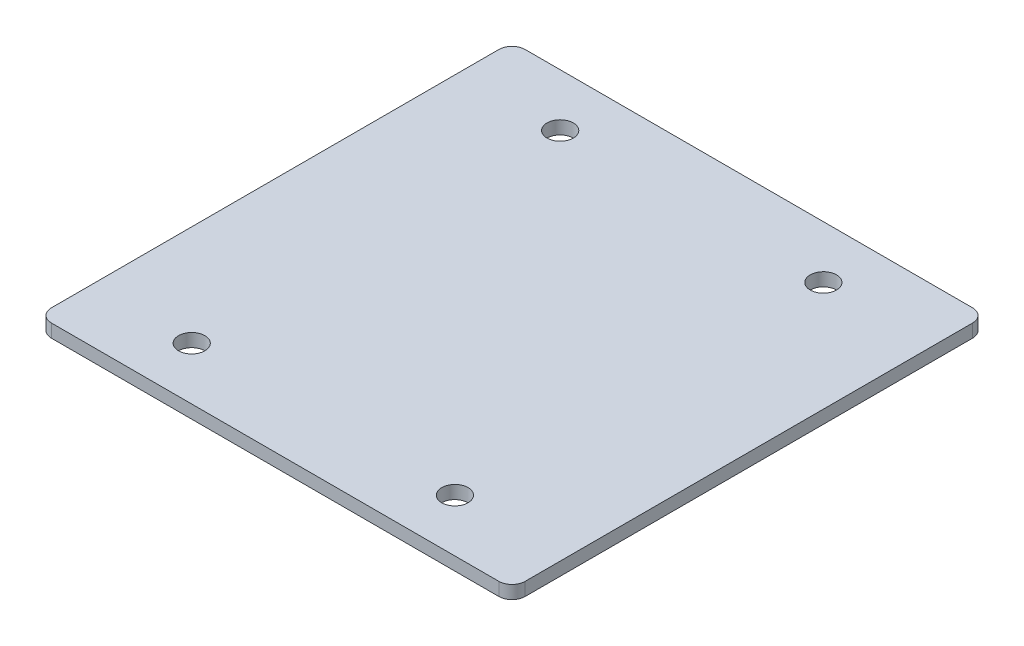
ISO-10303-21;
HEADER;
FILE_DESCRIPTION(('STEP AP214'),'2;1');
FILE_NAME('part.step','',(''),(''),'','','');
FILE_SCHEMA(('AUTOMOTIVE_DESIGN { 1 0 10303 214 1 1 1 1 }'));
ENDSEC;
DATA;
#1=APPLICATION_CONTEXT('core data for automotive mechanical design processes');
#2=APPLICATION_PROTOCOL_DEFINITION('international standard','automotive_design',2000,#1);
#3=PRODUCT_CONTEXT('',#1,'mechanical');
#4=PRODUCT('Part','Part','',(#3));
#5=PRODUCT_RELATED_PRODUCT_CATEGORY('part','',(#4));
#6=PRODUCT_DEFINITION_FORMATION('','',#4);
#7=PRODUCT_DEFINITION_CONTEXT('part definition',#1,'design');
#8=PRODUCT_DEFINITION('design','',#6,#7);
#9=PRODUCT_DEFINITION_SHAPE('','',#8);
#10=(LENGTH_UNIT() NAMED_UNIT(*) SI_UNIT(.MILLI.,.METRE.));
#11=(NAMED_UNIT(*) PLANE_ANGLE_UNIT() SI_UNIT($,.RADIAN.));
#12=(NAMED_UNIT(*) SI_UNIT($,.STERADIAN.) SOLID_ANGLE_UNIT());
#13=UNCERTAINTY_MEASURE_WITH_UNIT(LENGTH_MEASURE(1.E-05),#10,'distance_accuracy_value','');
#14=(GEOMETRIC_REPRESENTATION_CONTEXT(3) GLOBAL_UNCERTAINTY_ASSIGNED_CONTEXT((#13)) GLOBAL_UNIT_ASSIGNED_CONTEXT((#10,
#11,#12)) REPRESENTATION_CONTEXT('',''));
#15=CARTESIAN_POINT('',(0.,0.,0.));
#16=DIRECTION('',(0.,0.,1.));
#17=DIRECTION('',(1.,0.,0.));
#18=AXIS2_PLACEMENT_3D('',#15,#16,#17);
#19=CARTESIAN_POINT('',(0.,3.175,0.));
#20=DIRECTION('',(1.,0.,0.));
#21=DIRECTION('',(0.,0.,-1.));
#22=AXIS2_PLACEMENT_3D('',#19,#20,#21);
#23=PLANE('',#22);
#24=DIRECTION('',(0.,0.,1.));
#25=VECTOR('',#24,1.);
#26=CARTESIAN_POINT('',(0.,3.175,0.));
#27=LINE('',#26,#25);
#28=CARTESIAN_POINT('',(0.,3.175,-111.125));
#29=VERTEX_POINT('',#28);
#30=CARTESIAN_POINT('',(0.,3.175,-3.175));
#31=VERTEX_POINT('',#30);
#32=EDGE_CURVE('E124',#29,#31,#27,.T.);
#33=ORIENTED_EDGE('',*,*,#32,.F.);
#34=DIRECTION('',(0.,-1.,0.));
#35=VECTOR('',#34,1.);
#36=CARTESIAN_POINT('',(0.,3.175,-111.125));
#37=LINE('',#36,#35);
#38=CARTESIAN_POINT('',(0.,0.,-111.125));
#39=VERTEX_POINT('',#38);
#40=EDGE_CURVE('E150',#29,#39,#37,.T.);
#41=ORIENTED_EDGE('',*,*,#40,.T.);
#42=DIRECTION('',(0.,0.,1.));
#43=VECTOR('',#42,1.);
#44=CARTESIAN_POINT('',(0.,0.,0.));
#45=LINE('',#44,#43);
#46=CARTESIAN_POINT('',(0.,0.,-3.175));
#47=VERTEX_POINT('',#46);
#48=EDGE_CURVE('E156',#39,#47,#45,.T.);
#49=ORIENTED_EDGE('',*,*,#48,.T.);
#50=DIRECTION('',(0.,-1.,0.));
#51=VECTOR('',#50,1.);
#52=CARTESIAN_POINT('',(0.,3.175,-3.175));
#53=LINE('',#52,#51);
#54=EDGE_CURVE('E148',#47,#31,#53,.F.);
#55=ORIENTED_EDGE('',*,*,#54,.T.);
#56=EDGE_LOOP('',(#33,#41,#49,#55));
#57=FACE_BOUND('',#56,.T.);
#58=ADVANCED_FACE('F32',(#57),#23,.F.);
#59=CARTESIAN_POINT('',(0.,3.175,0.));
#60=DIRECTION('',(0.,0.,-1.));
#61=DIRECTION('',(-1.,0.,0.));
#62=AXIS2_PLACEMENT_3D('',#59,#60,#61);
#63=PLANE('',#62);
#64=DIRECTION('',(1.,0.,0.));
#65=VECTOR('',#64,1.);
#66=CARTESIAN_POINT('',(0.,3.175,0.));
#67=LINE('',#66,#65);
#68=CARTESIAN_POINT('',(3.175,3.175,0.));
#69=VERTEX_POINT('',#68);
#70=CARTESIAN_POINT('',(111.125,3.175,0.));
#71=VERTEX_POINT('',#70);
#72=EDGE_CURVE('E127',#69,#71,#67,.T.);
#73=ORIENTED_EDGE('',*,*,#72,.F.);
#74=DIRECTION('',(0.,-1.,0.));
#75=VECTOR('',#74,1.);
#76=CARTESIAN_POINT('',(3.175,3.175,0.));
#77=LINE('',#76,#75);
#78=CARTESIAN_POINT('',(3.175,0.,0.));
#79=VERTEX_POINT('',#78);
#80=EDGE_CURVE('E11',#69,#79,#77,.T.);
#81=ORIENTED_EDGE('',*,*,#80,.T.);
#82=DIRECTION('',(1.,0.,0.));
#83=VECTOR('',#82,1.);
#84=CARTESIAN_POINT('',(0.,0.,0.));
#85=LINE('',#84,#83);
#86=CARTESIAN_POINT('',(111.125,0.,0.));
#87=VERTEX_POINT('',#86);
#88=EDGE_CURVE('E129',#79,#87,#85,.T.);
#89=ORIENTED_EDGE('',*,*,#88,.T.);
#90=DIRECTION('',(0.,-1.,0.));
#91=VECTOR('',#90,1.);
#92=CARTESIAN_POINT('',(111.125,3.175,0.));
#93=LINE('',#92,#91);
#94=EDGE_CURVE('E40',#87,#71,#93,.F.);
#95=ORIENTED_EDGE('',*,*,#94,.T.);
#96=EDGE_LOOP('',(#73,#81,#89,#95));
#97=FACE_BOUND('',#96,.T.);
#98=ADVANCED_FACE('F217',(#97),#63,.F.);
#99=CARTESIAN_POINT('',(114.3,3.175,0.));
#100=DIRECTION('',(-1.,0.,0.));
#101=DIRECTION('',(0.,0.,1.));
#102=AXIS2_PLACEMENT_3D('',#99,#100,#101);
#103=PLANE('',#102);
#104=DIRECTION('',(0.,0.,-1.));
#105=VECTOR('',#104,1.);
#106=CARTESIAN_POINT('',(114.3,0.,0.));
#107=LINE('',#106,#105);
#108=CARTESIAN_POINT('',(114.3,0.,-3.175));
#109=VERTEX_POINT('',#108);
#110=CARTESIAN_POINT('',(114.3,0.,-111.125));
#111=VERTEX_POINT('',#110);
#112=EDGE_CURVE('E125',#109,#111,#107,.T.);
#113=ORIENTED_EDGE('',*,*,#112,.T.);
#114=DIRECTION('',(0.,-1.,0.));
#115=VECTOR('',#114,1.);
#116=CARTESIAN_POINT('',(114.3,3.175,-111.125));
#117=LINE('',#116,#115);
#118=CARTESIAN_POINT('',(114.3,3.175,-111.125));
#119=VERTEX_POINT('',#118);
#120=EDGE_CURVE('E103',#111,#119,#117,.F.);
#121=ORIENTED_EDGE('',*,*,#120,.T.);
#122=DIRECTION('',(0.,0.,-1.));
#123=VECTOR('',#122,1.);
#124=CARTESIAN_POINT('',(114.3,3.175,0.));
#125=LINE('',#124,#123);
#126=CARTESIAN_POINT('',(114.3,3.175,-3.175));
#127=VERTEX_POINT('',#126);
#128=EDGE_CURVE('E168',#127,#119,#125,.T.);
#129=ORIENTED_EDGE('',*,*,#128,.F.);
#130=DIRECTION('',(0.,-1.,0.));
#131=VECTOR('',#130,1.);
#132=CARTESIAN_POINT('',(114.3,3.175,-3.175));
#133=LINE('',#132,#131);
#134=EDGE_CURVE('E108',#127,#109,#133,.T.);
#135=ORIENTED_EDGE('',*,*,#134,.T.);
#136=EDGE_LOOP('',(#113,#121,#129,#135));
#137=FACE_BOUND('',#136,.T.);
#138=ADVANCED_FACE('F215',(#137),#103,.F.);
#139=CARTESIAN_POINT('',(0.,3.175,-114.3));
#140=DIRECTION('',(0.,0.,1.));
#141=DIRECTION('',(1.,0.,0.));
#142=AXIS2_PLACEMENT_3D('',#139,#140,#141);
#143=PLANE('',#142);
#144=DIRECTION('',(-1.,0.,0.));
#145=VECTOR('',#144,1.);
#146=CARTESIAN_POINT('',(0.,3.175,-114.3));
#147=LINE('',#146,#145);
#148=CARTESIAN_POINT('',(111.125,3.175,-114.3));
#149=VERTEX_POINT('',#148);
#150=CARTESIAN_POINT('',(3.175,3.175,-114.3));
#151=VERTEX_POINT('',#150);
#152=EDGE_CURVE('E118',#149,#151,#147,.T.);
#153=ORIENTED_EDGE('',*,*,#152,.F.);
#154=DIRECTION('',(0.,-1.,0.));
#155=VECTOR('',#154,1.);
#156=CARTESIAN_POINT('',(111.125,3.175,-114.3));
#157=LINE('',#156,#155);
#158=CARTESIAN_POINT('',(111.125,0.,-114.3));
#159=VERTEX_POINT('',#158);
#160=EDGE_CURVE('E102',#149,#159,#157,.T.);
#161=ORIENTED_EDGE('',*,*,#160,.T.);
#162=DIRECTION('',(-1.,0.,0.));
#163=VECTOR('',#162,1.);
#164=CARTESIAN_POINT('',(0.,0.,-114.3));
#165=LINE('',#164,#163);
#166=CARTESIAN_POINT('',(3.175,0.,-114.3));
#167=VERTEX_POINT('',#166);
#168=EDGE_CURVE('E115',#159,#167,#165,.T.);
#169=ORIENTED_EDGE('',*,*,#168,.T.);
#170=DIRECTION('',(0.,-1.,0.));
#171=VECTOR('',#170,1.);
#172=CARTESIAN_POINT('',(3.175,3.175,-114.3));
#173=LINE('',#172,#171);
#174=EDGE_CURVE('E120',#167,#151,#173,.F.);
#175=ORIENTED_EDGE('',*,*,#174,.T.);
#176=EDGE_LOOP('',(#153,#161,#169,#175));
#177=FACE_BOUND('',#176,.T.);
#178=ADVANCED_FACE('F114',(#177),#143,.F.);
#179=CARTESIAN_POINT('',(0.,3.175,0.));
#180=DIRECTION('',(0.,-1.,0.));
#181=DIRECTION('',(0.,0.,-1.));
#182=AXIS2_PLACEMENT_3D('',#179,#180,#181);
#183=PLANE('',#182);
#184=CARTESIAN_POINT('',(87.8229157501048,3.175,-101.6));
#185=DIRECTION('',(0.,1.,0.));
#186=DIRECTION('',(0.,0.,1.));
#187=AXIS2_PLACEMENT_3D('',#184,#185,#186);
#188=CIRCLE('',#187,3.175);
#189=CARTESIAN_POINT('',(87.8229157501048,3.175,-98.425));
#190=VERTEX_POINT('',#189);
#191=EDGE_CURVE('E187',#190,#190,#188,.T.);
#192=ORIENTED_EDGE('',*,*,#191,.F.);
#193=EDGE_LOOP('',(#192));
#194=FACE_BOUND('',#193,.T.);
#195=CARTESIAN_POINT('',(87.8229157501048,3.175,-12.7));
#196=DIRECTION('',(0.,1.,0.));
#197=DIRECTION('',(0.,0.,1.));
#198=AXIS2_PLACEMENT_3D('',#195,#196,#197);
#199=CIRCLE('',#198,3.175);
#200=CARTESIAN_POINT('',(87.8229157501048,3.175,-9.52500000000001));
#201=VERTEX_POINT('',#200);
#202=EDGE_CURVE('E181',#201,#201,#199,.T.);
#203=ORIENTED_EDGE('',*,*,#202,.F.);
#204=EDGE_LOOP('',(#203));
#205=FACE_BOUND('',#204,.T.);
#206=CARTESIAN_POINT('',(24.3229157501048,3.175,-12.7));
#207=DIRECTION('',(0.,1.,0.));
#208=DIRECTION('',(0.,0.,1.));
#209=AXIS2_PLACEMENT_3D('',#206,#207,#208);
#210=CIRCLE('',#209,3.175);
#211=CARTESIAN_POINT('',(24.3229157501048,3.175,-9.525));
#212=VERTEX_POINT('',#211);
#213=EDGE_CURVE('E175',#212,#212,#210,.T.);
#214=ORIENTED_EDGE('',*,*,#213,.F.);
#215=EDGE_LOOP('',(#214));
#216=FACE_BOUND('',#215,.T.);
#217=CARTESIAN_POINT('',(24.3229157501048,3.175,-101.6));
#218=DIRECTION('',(0.,1.,0.));
#219=DIRECTION('',(0.,0.,1.));
#220=AXIS2_PLACEMENT_3D('',#217,#218,#219);
#221=CIRCLE('',#220,3.175);
#222=CARTESIAN_POINT('',(24.3229157501048,3.175,-98.425));
#223=VERTEX_POINT('',#222);
#224=EDGE_CURVE('E164',#223,#223,#221,.T.);
#225=ORIENTED_EDGE('',*,*,#224,.F.);
#226=EDGE_LOOP('',(#225));
#227=FACE_BOUND('',#226,.T.);
#228=ORIENTED_EDGE('',*,*,#128,.T.);
#229=CARTESIAN_POINT('',(111.125,3.175,-111.125));
#230=DIRECTION('',(0.,-1.,0.));
#231=DIRECTION('',(0.,0.,-1.));
#232=AXIS2_PLACEMENT_3D('',#229,#230,#231);
#233=CIRCLE('',#232,3.175);
#234=EDGE_CURVE('E146',#119,#149,#233,.F.);
#235=ORIENTED_EDGE('',*,*,#234,.T.);
#236=ORIENTED_EDGE('',*,*,#152,.T.);
#237=CARTESIAN_POINT('',(3.175,3.175,-111.125));
#238=DIRECTION('',(0.,-1.,0.));
#239=DIRECTION('',(0.,0.,-1.));
#240=AXIS2_PLACEMENT_3D('',#237,#238,#239);
#241=CIRCLE('',#240,3.175);
#242=EDGE_CURVE('E144',#151,#29,#241,.F.);
#243=ORIENTED_EDGE('',*,*,#242,.T.);
#244=ORIENTED_EDGE('',*,*,#32,.T.);
#245=CARTESIAN_POINT('',(3.175,3.175,-3.175));
#246=DIRECTION('',(0.,-1.,0.));
#247=DIRECTION('',(0.,0.,-1.));
#248=AXIS2_PLACEMENT_3D('',#245,#246,#247);
#249=CIRCLE('',#248,3.175);
#250=EDGE_CURVE('E53',#31,#69,#249,.F.);
#251=ORIENTED_EDGE('',*,*,#250,.T.);
#252=ORIENTED_EDGE('',*,*,#72,.T.);
#253=CARTESIAN_POINT('',(111.125,3.175,-3.175));
#254=DIRECTION('',(0.,-1.,0.));
#255=DIRECTION('',(0.,0.,-1.));
#256=AXIS2_PLACEMENT_3D('',#253,#254,#255);
#257=CIRCLE('',#256,3.175);
#258=EDGE_CURVE('E141',#71,#127,#257,.F.);
#259=ORIENTED_EDGE('',*,*,#258,.T.);
#260=EDGE_LOOP('',(#228,#235,#236,#243,#244,#251,#252,#259));
#261=FACE_BOUND('',#260,.T.);
#262=ADVANCED_FACE('F202',(#194,#205,#216,#227,#261),#183,.F.);
#263=CARTESIAN_POINT('',(0.,0.,0.));
#264=DIRECTION('',(0.,-1.,0.));
#265=DIRECTION('',(0.,0.,-1.));
#266=AXIS2_PLACEMENT_3D('',#263,#264,#265);
#267=PLANE('',#266);
#268=CARTESIAN_POINT('',(87.8229157501048,0.,-101.6));
#269=DIRECTION('',(0.,1.,0.));
#270=DIRECTION('',(0.,0.,1.));
#271=AXIS2_PLACEMENT_3D('',#268,#269,#270);
#272=CIRCLE('',#271,3.175);
#273=CARTESIAN_POINT('',(87.8229157501048,0.,-98.425));
#274=VERTEX_POINT('',#273);
#275=EDGE_CURVE('E184',#274,#274,#272,.T.);
#276=ORIENTED_EDGE('',*,*,#275,.T.);
#277=EDGE_LOOP('',(#276));
#278=FACE_BOUND('',#277,.T.);
#279=CARTESIAN_POINT('',(87.8229157501048,0.,-12.7));
#280=DIRECTION('',(0.,1.,0.));
#281=DIRECTION('',(0.,0.,1.));
#282=AXIS2_PLACEMENT_3D('',#279,#280,#281);
#283=CIRCLE('',#282,3.175);
#284=CARTESIAN_POINT('',(87.8229157501048,0.,-9.52500000000001));
#285=VERTEX_POINT('',#284);
#286=EDGE_CURVE('E178',#285,#285,#283,.T.);
#287=ORIENTED_EDGE('',*,*,#286,.T.);
#288=EDGE_LOOP('',(#287));
#289=FACE_BOUND('',#288,.T.);
#290=CARTESIAN_POINT('',(24.3229157501048,0.,-12.7));
#291=DIRECTION('',(0.,1.,0.));
#292=DIRECTION('',(0.,0.,1.));
#293=AXIS2_PLACEMENT_3D('',#290,#291,#292);
#294=CIRCLE('',#293,3.175);
#295=CARTESIAN_POINT('',(24.3229157501048,0.,-9.525));
#296=VERTEX_POINT('',#295);
#297=EDGE_CURVE('E173',#296,#296,#294,.T.);
#298=ORIENTED_EDGE('',*,*,#297,.T.);
#299=EDGE_LOOP('',(#298));
#300=FACE_BOUND('',#299,.T.);
#301=CARTESIAN_POINT('',(24.3229157501048,0.,-101.6));
#302=DIRECTION('',(0.,1.,0.));
#303=DIRECTION('',(0.,0.,1.));
#304=AXIS2_PLACEMENT_3D('',#301,#302,#303);
#305=CIRCLE('',#304,3.175);
#306=CARTESIAN_POINT('',(24.3229157501048,0.,-98.425));
#307=VERTEX_POINT('',#306);
#308=EDGE_CURVE('E161',#307,#307,#305,.T.);
#309=ORIENTED_EDGE('',*,*,#308,.T.);
#310=EDGE_LOOP('',(#309));
#311=FACE_BOUND('',#310,.T.);
#312=ORIENTED_EDGE('',*,*,#168,.F.);
#313=CARTESIAN_POINT('',(111.125,0.,-111.125));
#314=DIRECTION('',(0.,-1.,0.));
#315=DIRECTION('',(0.,0.,-1.));
#316=AXIS2_PLACEMENT_3D('',#313,#314,#315);
#317=CIRCLE('',#316,3.175);
#318=EDGE_CURVE('E98',#159,#111,#317,.T.);
#319=ORIENTED_EDGE('',*,*,#318,.T.);
#320=ORIENTED_EDGE('',*,*,#112,.F.);
#321=CARTESIAN_POINT('',(111.125,0.,-3.175));
#322=DIRECTION('',(0.,-1.,0.));
#323=DIRECTION('',(0.,0.,-1.));
#324=AXIS2_PLACEMENT_3D('',#321,#322,#323);
#325=CIRCLE('',#324,3.175);
#326=EDGE_CURVE('E119',#109,#87,#325,.T.);
#327=ORIENTED_EDGE('',*,*,#326,.T.);
#328=ORIENTED_EDGE('',*,*,#88,.F.);
#329=CARTESIAN_POINT('',(3.175,0.,-3.175));
#330=DIRECTION('',(0.,-1.,0.));
#331=DIRECTION('',(0.,0.,-1.));
#332=AXIS2_PLACEMENT_3D('',#329,#330,#331);
#333=CIRCLE('',#332,3.175);
#334=EDGE_CURVE('E135',#79,#47,#333,.T.);
#335=ORIENTED_EDGE('',*,*,#334,.T.);
#336=ORIENTED_EDGE('',*,*,#48,.F.);
#337=CARTESIAN_POINT('',(3.175,0.,-111.125));
#338=DIRECTION('',(0.,-1.,0.));
#339=DIRECTION('',(0.,0.,-1.));
#340=AXIS2_PLACEMENT_3D('',#337,#338,#339);
#341=CIRCLE('',#340,3.175);
#342=EDGE_CURVE('E109',#39,#167,#341,.T.);
#343=ORIENTED_EDGE('',*,*,#342,.T.);
#344=EDGE_LOOP('',(#312,#319,#320,#327,#328,#335,#336,#343));
#345=FACE_BOUND('',#344,.T.);
#346=ADVANCED_FACE('F122',(#278,#289,#300,#311,#345),#267,.T.);
#347=CARTESIAN_POINT('',(111.125,3.175,-111.125));
#348=DIRECTION('',(0.,-1.,0.));
#349=DIRECTION('',(0.,0.,-1.));
#350=AXIS2_PLACEMENT_3D('',#347,#348,#349);
#351=CYLINDRICAL_SURFACE('',#350,3.175);
#352=ORIENTED_EDGE('',*,*,#234,.F.);
#353=ORIENTED_EDGE('',*,*,#120,.F.);
#354=ORIENTED_EDGE('',*,*,#318,.F.);
#355=ORIENTED_EDGE('',*,*,#160,.F.);
#356=EDGE_LOOP('',(#352,#353,#354,#355));
#357=FACE_BOUND('',#356,.T.);
#358=ADVANCED_FACE('F101',(#357),#351,.T.);
#359=CARTESIAN_POINT('',(3.175,3.175,-111.125));
#360=DIRECTION('',(0.,-1.,0.));
#361=DIRECTION('',(0.,0.,-1.));
#362=AXIS2_PLACEMENT_3D('',#359,#360,#361);
#363=CYLINDRICAL_SURFACE('',#362,3.175);
#364=ORIENTED_EDGE('',*,*,#242,.F.);
#365=ORIENTED_EDGE('',*,*,#174,.F.);
#366=ORIENTED_EDGE('',*,*,#342,.F.);
#367=ORIENTED_EDGE('',*,*,#40,.F.);
#368=EDGE_LOOP('',(#364,#365,#366,#367));
#369=FACE_BOUND('',#368,.T.);
#370=ADVANCED_FACE('F221',(#369),#363,.T.);
#371=CARTESIAN_POINT('',(3.175,3.175,-3.175));
#372=DIRECTION('',(0.,-1.,0.));
#373=DIRECTION('',(0.,0.,-1.));
#374=AXIS2_PLACEMENT_3D('',#371,#372,#373);
#375=CYLINDRICAL_SURFACE('',#374,3.175);
#376=ORIENTED_EDGE('',*,*,#250,.F.);
#377=ORIENTED_EDGE('',*,*,#54,.F.);
#378=ORIENTED_EDGE('',*,*,#334,.F.);
#379=ORIENTED_EDGE('',*,*,#80,.F.);
#380=EDGE_LOOP('',(#376,#377,#378,#379));
#381=FACE_BOUND('',#380,.T.);
#382=ADVANCED_FACE('F220',(#381),#375,.T.);
#383=CARTESIAN_POINT('',(111.125,3.175,-3.175));
#384=DIRECTION('',(0.,-1.,0.));
#385=DIRECTION('',(0.,0.,-1.));
#386=AXIS2_PLACEMENT_3D('',#383,#384,#385);
#387=CYLINDRICAL_SURFACE('',#386,3.175);
#388=ORIENTED_EDGE('',*,*,#258,.F.);
#389=ORIENTED_EDGE('',*,*,#94,.F.);
#390=ORIENTED_EDGE('',*,*,#326,.F.);
#391=ORIENTED_EDGE('',*,*,#134,.F.);
#392=EDGE_LOOP('',(#388,#389,#390,#391));
#393=FACE_BOUND('',#392,.T.);
#394=ADVANCED_FACE('F34',(#393),#387,.T.);
#395=CARTESIAN_POINT('',(24.3229157501048,0.,-101.6));
#396=DIRECTION('',(0.,1.,0.));
#397=DIRECTION('',(0.,0.,1.));
#398=AXIS2_PLACEMENT_3D('',#395,#396,#397);
#399=CYLINDRICAL_SURFACE('',#398,3.175);
#400=ORIENTED_EDGE('',*,*,#308,.F.);
#401=EDGE_LOOP('',(#400));
#402=FACE_BOUND('',#401,.T.);
#403=ORIENTED_EDGE('',*,*,#224,.T.);
#404=EDGE_LOOP('',(#403));
#405=FACE_BOUND('',#404,.T.);
#406=ADVANCED_FACE('F242',(#402,#405),#399,.F.);
#407=CARTESIAN_POINT('',(24.3229157501048,0.,-12.7));
#408=DIRECTION('',(0.,1.,0.));
#409=DIRECTION('',(0.,0.,1.));
#410=AXIS2_PLACEMENT_3D('',#407,#408,#409);
#411=CYLINDRICAL_SURFACE('',#410,3.175);
#412=ORIENTED_EDGE('',*,*,#297,.F.);
#413=EDGE_LOOP('',(#412));
#414=FACE_BOUND('',#413,.T.);
#415=ORIENTED_EDGE('',*,*,#213,.T.);
#416=EDGE_LOOP('',(#415));
#417=FACE_BOUND('',#416,.T.);
#418=ADVANCED_FACE('F245',(#414,#417),#411,.F.);
#419=CARTESIAN_POINT('',(87.8229157501048,0.,-12.7));
#420=DIRECTION('',(0.,1.,0.));
#421=DIRECTION('',(0.,0.,1.));
#422=AXIS2_PLACEMENT_3D('',#419,#420,#421);
#423=CYLINDRICAL_SURFACE('',#422,3.175);
#424=ORIENTED_EDGE('',*,*,#286,.F.);
#425=EDGE_LOOP('',(#424));
#426=FACE_BOUND('',#425,.T.);
#427=ORIENTED_EDGE('',*,*,#202,.T.);
#428=EDGE_LOOP('',(#427));
#429=FACE_BOUND('',#428,.T.);
#430=ADVANCED_FACE('F198',(#426,#429),#423,.F.);
#431=CARTESIAN_POINT('',(87.8229157501048,0.,-101.6));
#432=DIRECTION('',(0.,1.,0.));
#433=DIRECTION('',(0.,0.,1.));
#434=AXIS2_PLACEMENT_3D('',#431,#432,#433);
#435=CYLINDRICAL_SURFACE('',#434,3.175);
#436=ORIENTED_EDGE('',*,*,#275,.F.);
#437=EDGE_LOOP('',(#436));
#438=FACE_BOUND('',#437,.T.);
#439=ORIENTED_EDGE('',*,*,#191,.T.);
#440=EDGE_LOOP('',(#439));
#441=FACE_BOUND('',#440,.T.);
#442=ADVANCED_FACE('F195',(#438,#441),#435,.F.);
#443=CLOSED_SHELL('',(#58,#98,#138,#178,#262,#346,#358,#370,#382,#394,#406,#418,#430,#442));
#444=MANIFOLD_SOLID_BREP('B2',#443);
#445=ADVANCED_BREP_SHAPE_REPRESENTATION('',(#18,#444),#14);
#446=SHAPE_DEFINITION_REPRESENTATION(#9,#445);
ENDSEC;
END-ISO-10303-21;
